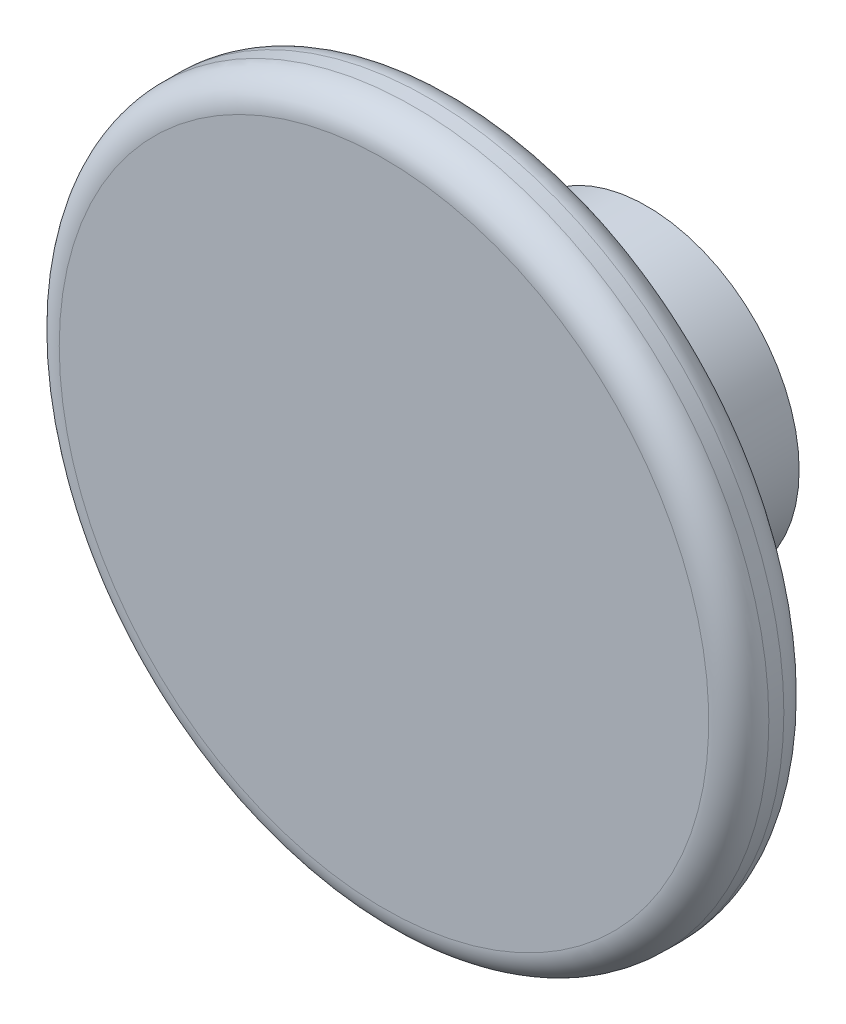
ISO-10303-21;
HEADER;
FILE_DESCRIPTION(('STEP AP214'),'2;1');
FILE_NAME('part.step','',(''),(''),'','','');
FILE_SCHEMA(('AUTOMOTIVE_DESIGN { 1 0 10303 214 1 1 1 1 }'));
ENDSEC;
DATA;
#1=APPLICATION_CONTEXT('core data for automotive mechanical design processes');
#2=APPLICATION_PROTOCOL_DEFINITION('international standard','automotive_design',2000,#1);
#3=PRODUCT_CONTEXT('',#1,'mechanical');
#4=PRODUCT('Part','Part','',(#3));
#5=PRODUCT_RELATED_PRODUCT_CATEGORY('part','',(#4));
#6=PRODUCT_DEFINITION_FORMATION('','',#4);
#7=PRODUCT_DEFINITION_CONTEXT('part definition',#1,'design');
#8=PRODUCT_DEFINITION('design','',#6,#7);
#9=PRODUCT_DEFINITION_SHAPE('','',#8);
#10=(LENGTH_UNIT() NAMED_UNIT(*) SI_UNIT(.MILLI.,.METRE.));
#11=(NAMED_UNIT(*) PLANE_ANGLE_UNIT() SI_UNIT($,.RADIAN.));
#12=(NAMED_UNIT(*) SI_UNIT($,.STERADIAN.) SOLID_ANGLE_UNIT());
#13=UNCERTAINTY_MEASURE_WITH_UNIT(LENGTH_MEASURE(1.E-05),#10,'distance_accuracy_value','');
#14=(GEOMETRIC_REPRESENTATION_CONTEXT(3) GLOBAL_UNCERTAINTY_ASSIGNED_CONTEXT((#13)) GLOBAL_UNIT_ASSIGNED_CONTEXT((#10,
#11,#12)) REPRESENTATION_CONTEXT('',''));
#15=CARTESIAN_POINT('',(0.,0.,0.));
#16=DIRECTION('',(0.,0.,1.));
#17=DIRECTION('',(1.,0.,0.));
#18=AXIS2_PLACEMENT_3D('',#15,#16,#17);
#19=CARTESIAN_POINT('',(-6.4389,0.,0.));
#20=DIRECTION('',(0.,0.,1.));
#21=DIRECTION('',(1.,0.,0.));
#22=AXIS2_PLACEMENT_3D('',#19,#20,#21);
#23=PLANE('',#22);
#24=CARTESIAN_POINT('',(0.,0.,0.));
#25=DIRECTION('',(0.,0.,1.));
#26=DIRECTION('',(1.,0.,0.));
#27=AXIS2_PLACEMENT_3D('',#24,#25,#26);
#28=CIRCLE('',#27,12.8778);
#29=CARTESIAN_POINT('',(12.8778,0.,0.));
#30=VERTEX_POINT('',#29);
#31=EDGE_CURVE('E56',#30,#30,#28,.T.);
#32=ORIENTED_EDGE('',*,*,#31,.F.);
#33=EDGE_LOOP('',(#32));
#34=FACE_BOUND('',#33,.T.);
#35=ADVANCED_FACE('F35',(#34),#23,.F.);
#36=CARTESIAN_POINT('',(0.,0.,11.1125));
#37=DIRECTION('',(0.,0.,1.));
#38=DIRECTION('',(1.,0.,0.));
#39=AXIS2_PLACEMENT_3D('',#36,#37,#38);
#40=CYLINDRICAL_SURFACE('',#39,12.8778);
#41=ORIENTED_EDGE('',*,*,#31,.T.);
#42=EDGE_LOOP('',(#41));
#43=FACE_BOUND('',#42,.T.);
#44=CARTESIAN_POINT('',(0.,0.,9.31062488196954));
#45=DIRECTION('',(0.,0.,1.));
#46=DIRECTION('',(1.,0.,0.));
#47=AXIS2_PLACEMENT_3D('',#44,#45,#46);
#48=CIRCLE('',#47,12.8778);
#49=CARTESIAN_POINT('',(12.8778,0.,9.31062488196954));
#50=VERTEX_POINT('',#49);
#51=EDGE_CURVE('E59',#50,#50,#48,.T.);
#52=ORIENTED_EDGE('',*,*,#51,.F.);
#53=EDGE_LOOP('',(#52));
#54=FACE_BOUND('',#53,.T.);
#55=ADVANCED_FACE('F78',(#43,#54),#40,.T.);
#56=CARTESIAN_POINT('',(0.,0.,9.31062488196954));
#57=DIRECTION('',(0.,0.,1.));
#58=DIRECTION('',(1.,0.,0.));
#59=AXIS2_PLACEMENT_3D('',#56,#57,#58);
#60=TOROIDAL_SURFACE('',#59,11.6078,1.27);
#61=ORIENTED_EDGE('',*,*,#51,.T.);
#62=EDGE_LOOP('',(#61));
#63=FACE_BOUND('',#62,.T.);
#64=CARTESIAN_POINT('',(0.,0.,9.72749709240072));
#65=DIRECTION('',(0.,0.,-1.));
#66=DIRECTION('',(-1.,0.,0.));
#67=AXIS2_PLACEMENT_3D('',#64,#65,#66);
#68=CIRCLE('',#67,12.8074322602336);
#69=CARTESIAN_POINT('',(-12.8074322602336,0.,9.72749709240072));
#70=VERTEX_POINT('',#69);
#71=EDGE_CURVE('E67',#70,#70,#68,.F.);
#72=ORIENTED_EDGE('',*,*,#71,.F.);
#73=EDGE_LOOP('',(#72));
#74=FACE_BOUND('',#73,.T.);
#75=ADVANCED_FACE('F73',(#63,#74),#60,.T.);
#76=CARTESIAN_POINT('',(0.,0.,9.72749709240072));
#77=DIRECTION('',(0.,0.,-1.));
#78=DIRECTION('',(-1.,0.,0.));
#79=AXIS2_PLACEMENT_3D('',#76,#77,#78);
#80=CONICAL_SURFACE('',#79,12.8074322602336,0.3344459141);
#81=CARTESIAN_POINT('',(0.,0.,14.605));
#82=DIRECTION('',(0.,0.,1.));
#83=DIRECTION('',(1.,0.,0.));
#84=AXIS2_PLACEMENT_3D('',#81,#82,#83);
#85=CIRCLE('',#84,11.1125);
#86=CARTESIAN_POINT('',(11.1125,0.,14.605));
#87=VERTEX_POINT('',#86);
#88=EDGE_CURVE('E62',#87,#87,#85,.T.);
#89=ORIENTED_EDGE('',*,*,#88,.F.);
#90=EDGE_LOOP('',(#89));
#91=FACE_BOUND('',#90,.T.);
#92=ORIENTED_EDGE('',*,*,#71,.T.);
#93=EDGE_LOOP('',(#92));
#94=FACE_BOUND('',#93,.T.);
#95=ADVANCED_FACE('F77',(#91,#94),#80,.T.);
#96=CARTESIAN_POINT('',(0.,0.,11.1125));
#97=DIRECTION('',(0.,0.,1.));
#98=DIRECTION('',(1.,0.,0.));
#99=AXIS2_PLACEMENT_3D('',#96,#97,#98);
#100=CYLINDRICAL_SURFACE('',#99,11.1125);
#101=CARTESIAN_POINT('',(0.,0.,15.875));
#102=DIRECTION('',(0.,0.,1.));
#103=DIRECTION('',(1.,0.,0.));
#104=AXIS2_PLACEMENT_3D('',#101,#102,#103);
#105=CIRCLE('',#104,11.1125);
#106=CARTESIAN_POINT('',(11.1125,0.,15.875));
#107=VERTEX_POINT('',#106);
#108=EDGE_CURVE('E55',#107,#107,#105,.F.);
#109=ORIENTED_EDGE('',*,*,#108,.T.);
#110=EDGE_LOOP('',(#109));
#111=FACE_BOUND('',#110,.T.);
#112=ORIENTED_EDGE('',*,*,#88,.T.);
#113=EDGE_LOOP('',(#112));
#114=FACE_BOUND('',#113,.T.);
#115=ADVANCED_FACE('F100',(#111,#114),#100,.T.);
#116=CARTESIAN_POINT('',(-15.33525,0.,15.875));
#117=DIRECTION('',(0.,0.,1.));
#118=DIRECTION('',(1.,0.,0.));
#119=AXIS2_PLACEMENT_3D('',#116,#117,#118);
#120=PLANE('',#119);
#121=CARTESIAN_POINT('',(0.,0.,15.875));
#122=DIRECTION('',(0.,0.,1.));
#123=DIRECTION('',(1.,0.,0.));
#124=AXIS2_PLACEMENT_3D('',#121,#122,#123);
#125=CIRCLE('',#124,27.46);
#126=CARTESIAN_POINT('',(27.46,0.,15.875));
#127=VERTEX_POINT('',#126);
#128=EDGE_CURVE('E42',#127,#127,#125,.F.);
#129=ORIENTED_EDGE('',*,*,#128,.T.);
#130=EDGE_LOOP('',(#129));
#131=FACE_BOUND('',#130,.T.);
#132=ORIENTED_EDGE('',*,*,#108,.F.);
#133=EDGE_LOOP('',(#132));
#134=FACE_BOUND('',#133,.T.);
#135=ADVANCED_FACE('F98',(#131,#134),#120,.F.);
#136=CARTESIAN_POINT('',(0.,0.,15.875));
#137=DIRECTION('',(0.,0.,1.));
#138=DIRECTION('',(1.,0.,0.));
#139=AXIS2_PLACEMENT_3D('',#136,#137,#138);
#140=CYLINDRICAL_SURFACE('',#139,30.);
#141=CARTESIAN_POINT('',(0.,0.,18.415));
#142=DIRECTION('',(0.,0.,1.));
#143=DIRECTION('',(1.,0.,0.));
#144=AXIS2_PLACEMENT_3D('',#141,#142,#143);
#145=CIRCLE('',#144,30.);
#146=CARTESIAN_POINT('',(30.,0.,18.415));
#147=VERTEX_POINT('',#146);
#148=EDGE_CURVE('E46',#147,#147,#145,.T.);
#149=ORIENTED_EDGE('',*,*,#148,.T.);
#150=EDGE_LOOP('',(#149));
#151=FACE_BOUND('',#150,.T.);
#152=CARTESIAN_POINT('',(0.,0.,19.685));
#153=DIRECTION('',(0.,0.,-1.));
#154=DIRECTION('',(-1.,0.,0.));
#155=AXIS2_PLACEMENT_3D('',#152,#153,#154);
#156=CIRCLE('',#155,30.);
#157=CARTESIAN_POINT('',(-30.,0.,19.685));
#158=VERTEX_POINT('',#157);
#159=EDGE_CURVE('E50',#158,#158,#156,.T.);
#160=ORIENTED_EDGE('',*,*,#159,.T.);
#161=EDGE_LOOP('',(#160));
#162=FACE_BOUND('',#161,.T.);
#163=ADVANCED_FACE('F86',(#151,#162),#140,.T.);
#164=CARTESIAN_POINT('',(-9.525,0.,22.225));
#165=DIRECTION('',(0.,0.,-1.));
#166=DIRECTION('',(-1.,0.,0.));
#167=AXIS2_PLACEMENT_3D('',#164,#165,#166);
#168=PLANE('',#167);
#169=CARTESIAN_POINT('',(0.,0.,22.225));
#170=DIRECTION('',(0.,0.,-1.));
#171=DIRECTION('',(-1.,0.,0.));
#172=AXIS2_PLACEMENT_3D('',#169,#170,#171);
#173=CIRCLE('',#172,27.46);
#174=CARTESIAN_POINT('',(-27.46,0.,22.225));
#175=VERTEX_POINT('',#174);
#176=EDGE_CURVE('E10',#175,#175,#173,.F.);
#177=ORIENTED_EDGE('',*,*,#176,.T.);
#178=EDGE_LOOP('',(#177));
#179=FACE_BOUND('',#178,.T.);
#180=ADVANCED_FACE('F89',(#179),#168,.F.);
#181=CARTESIAN_POINT('',(0.,0.,18.415));
#182=DIRECTION('',(0.,0.,1.));
#183=DIRECTION('',(1.,0.,0.));
#184=AXIS2_PLACEMENT_3D('',#181,#182,#183);
#185=TOROIDAL_SURFACE('',#184,27.46,2.54);
#186=ORIENTED_EDGE('',*,*,#128,.F.);
#187=EDGE_LOOP('',(#186));
#188=FACE_BOUND('',#187,.T.);
#189=ORIENTED_EDGE('',*,*,#148,.F.);
#190=EDGE_LOOP('',(#189));
#191=FACE_BOUND('',#190,.T.);
#192=ADVANCED_FACE('F87',(#188,#191),#185,.T.);
#193=CARTESIAN_POINT('',(0.,0.,19.685));
#194=DIRECTION('',(0.,0.,-1.));
#195=DIRECTION('',(-1.,0.,0.));
#196=AXIS2_PLACEMENT_3D('',#193,#194,#195);
#197=TOROIDAL_SURFACE('',#196,27.46,2.54);
#198=ORIENTED_EDGE('',*,*,#159,.F.);
#199=EDGE_LOOP('',(#198));
#200=FACE_BOUND('',#199,.T.);
#201=ORIENTED_EDGE('',*,*,#176,.F.);
#202=EDGE_LOOP('',(#201));
#203=FACE_BOUND('',#202,.T.);
#204=ADVANCED_FACE('F37',(#200,#203),#197,.T.);
#205=CLOSED_SHELL('',(#35,#55,#75,#95,#115,#135,#163,#180,#192,#204));
#206=MANIFOLD_SOLID_BREP('B2',#205);
#207=ADVANCED_BREP_SHAPE_REPRESENTATION('',(#18,#206),#14);
#208=SHAPE_DEFINITION_REPRESENTATION(#9,#207);
ENDSEC;
END-ISO-10303-21;
